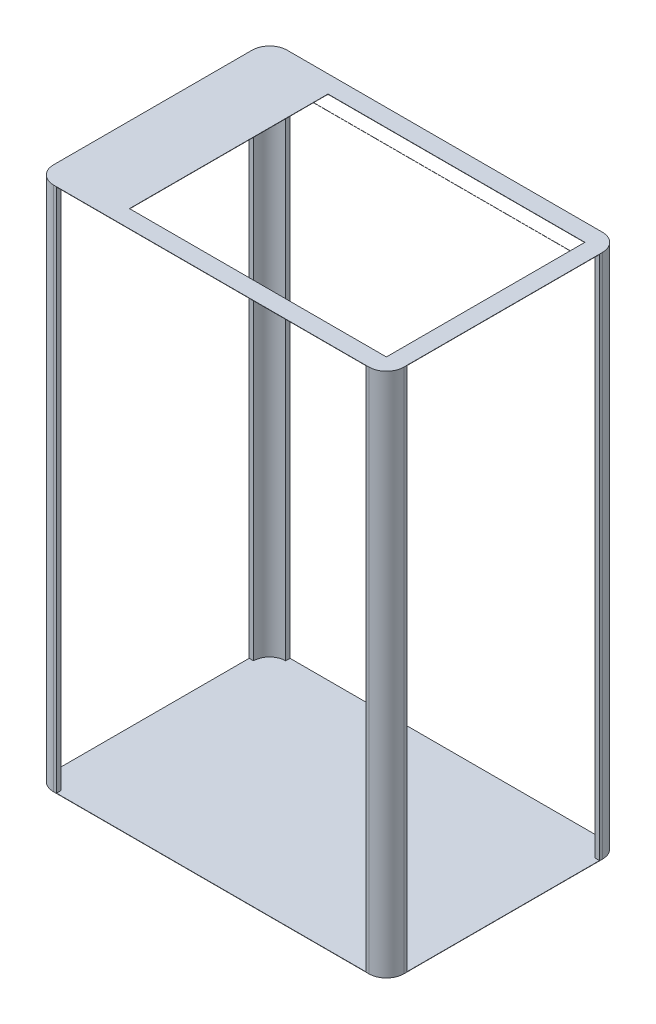
ISO-10303-21;
HEADER;
FILE_DESCRIPTION(('STEP AP214'),'2;1');
FILE_NAME('part.step','',(''),(''),'','','');
FILE_SCHEMA(('AUTOMOTIVE_DESIGN { 1 0 10303 214 1 1 1 1 }'));
ENDSEC;
DATA;
#1=APPLICATION_CONTEXT('core data for automotive mechanical design processes');
#2=APPLICATION_PROTOCOL_DEFINITION('international standard','automotive_design',2000,#1);
#3=PRODUCT_CONTEXT('',#1,'mechanical');
#4=PRODUCT('Part','Part','',(#3));
#5=PRODUCT_RELATED_PRODUCT_CATEGORY('part','',(#4));
#6=PRODUCT_DEFINITION_FORMATION('','',#4);
#7=PRODUCT_DEFINITION_CONTEXT('part definition',#1,'design');
#8=PRODUCT_DEFINITION('design','',#6,#7);
#9=PRODUCT_DEFINITION_SHAPE('','',#8);
#10=(LENGTH_UNIT() NAMED_UNIT(*) SI_UNIT(.MILLI.,.METRE.));
#11=(NAMED_UNIT(*) PLANE_ANGLE_UNIT() SI_UNIT($,.RADIAN.));
#12=(NAMED_UNIT(*) SI_UNIT($,.STERADIAN.) SOLID_ANGLE_UNIT());
#13=UNCERTAINTY_MEASURE_WITH_UNIT(LENGTH_MEASURE(1.E-05),#10,'distance_accuracy_value','');
#14=(GEOMETRIC_REPRESENTATION_CONTEXT(3) GLOBAL_UNCERTAINTY_ASSIGNED_CONTEXT((#13)) GLOBAL_UNIT_ASSIGNED_CONTEXT((#10,
#11,#12)) REPRESENTATION_CONTEXT('',''));
#15=CARTESIAN_POINT('',(0.,0.,0.));
#16=DIRECTION('',(0.,0.,1.));
#17=DIRECTION('',(1.,0.,0.));
#18=AXIS2_PLACEMENT_3D('',#15,#16,#17);
#19=CARTESIAN_POINT('',(300.,450.,170.));
#20=DIRECTION('',(-1.,0.,0.));
#21=DIRECTION('',(0.,0.,1.));
#22=AXIS2_PLACEMENT_3D('',#19,#20,#21);
#23=PLANE('',#22);
#24=DIRECTION('',(0.,0.,-1.));
#25=VECTOR('',#24,1.);
#26=CARTESIAN_POINT('',(300.,-450.,170.));
#27=LINE('',#26,#25);
#28=CARTESIAN_POINT('',(300.,-450.,170.));
#29=VERTEX_POINT('',#28);
#30=CARTESIAN_POINT('',(300.,-450.,-170.));
#31=VERTEX_POINT('',#30);
#32=EDGE_CURVE('E480',#29,#31,#27,.T.);
#33=ORIENTED_EDGE('',*,*,#32,.T.);
#34=DIRECTION('',(0.,-1.,0.));
#35=VECTOR('',#34,1.);
#36=CARTESIAN_POINT('',(300.,450.,-170.));
#37=LINE('',#36,#35);
#38=CARTESIAN_POINT('',(300.,450.,-170.));
#39=VERTEX_POINT('',#38);
#40=EDGE_CURVE('E523',#39,#31,#37,.T.);
#41=ORIENTED_EDGE('',*,*,#40,.F.);
#42=DIRECTION('',(0.,0.,-1.));
#43=VECTOR('',#42,1.);
#44=CARTESIAN_POINT('',(300.,450.,170.));
#45=LINE('',#44,#43);
#46=CARTESIAN_POINT('',(300.,450.,170.));
#47=VERTEX_POINT('',#46);
#48=EDGE_CURVE('E454',#47,#39,#45,.T.);
#49=ORIENTED_EDGE('',*,*,#48,.F.);
#50=DIRECTION('',(0.,-1.,0.));
#51=VECTOR('',#50,1.);
#52=CARTESIAN_POINT('',(300.,450.,170.));
#53=LINE('',#52,#51);
#54=EDGE_CURVE('E527',#47,#29,#53,.T.);
#55=ORIENTED_EDGE('',*,*,#54,.T.);
#56=EDGE_LOOP('',(#33,#41,#49,#55));
#57=FACE_BOUND('',#56,.T.);
#58=DIRECTION('',(0.,0.,-1.));
#59=VECTOR('',#58,1.);
#60=CARTESIAN_POINT('',(300.,-449.5,165.));
#61=LINE('',#60,#59);
#62=CARTESIAN_POINT('',(300.,-449.5,165.));
#63=VERTEX_POINT('',#62);
#64=CARTESIAN_POINT('',(300.,-449.5,-165.));
#65=VERTEX_POINT('',#64);
#66=EDGE_CURVE('E308',#63,#65,#61,.T.);
#67=ORIENTED_EDGE('',*,*,#66,.F.);
#68=DIRECTION('',(0.,1.,0.));
#69=VECTOR('',#68,1.);
#70=CARTESIAN_POINT('',(300.,-449.5,165.));
#71=LINE('',#70,#69);
#72=CARTESIAN_POINT('',(300.,449.5,165.));
#73=VERTEX_POINT('',#72);
#74=EDGE_CURVE('E416',#63,#73,#71,.T.);
#75=ORIENTED_EDGE('',*,*,#74,.T.);
#76=DIRECTION('',(0.,0.,-1.));
#77=VECTOR('',#76,1.);
#78=CARTESIAN_POINT('',(300.,449.5,165.));
#79=LINE('',#78,#77);
#80=CARTESIAN_POINT('',(300.,449.5,-165.));
#81=VERTEX_POINT('',#80);
#82=EDGE_CURVE('E371',#73,#81,#79,.T.);
#83=ORIENTED_EDGE('',*,*,#82,.T.);
#84=DIRECTION('',(0.,1.,0.));
#85=VECTOR('',#84,1.);
#86=CARTESIAN_POINT('',(300.,-449.5,-165.));
#87=LINE('',#86,#85);
#88=EDGE_CURVE('E412',#65,#81,#87,.T.);
#89=ORIENTED_EDGE('',*,*,#88,.F.);
#90=EDGE_LOOP('',(#67,#75,#83,#89));
#91=FACE_BOUND('',#90,.T.);
#92=ADVANCED_FACE('F45',(#57,#91),#23,.F.);
#93=CARTESIAN_POINT('',(-270.,450.,-200.));
#94=DIRECTION('',(0.,0.,1.));
#95=DIRECTION('',(1.,0.,0.));
#96=AXIS2_PLACEMENT_3D('',#93,#94,#95);
#97=PLANE('',#96);
#98=DIRECTION('',(-1.,0.,0.));
#99=VECTOR('',#98,1.);
#100=CARTESIAN_POINT('',(-270.,-450.,-200.));
#101=LINE('',#100,#99);
#102=CARTESIAN_POINT('',(270.,-450.,-200.));
#103=VERTEX_POINT('',#102);
#104=CARTESIAN_POINT('',(-270.,-450.,-200.));
#105=VERTEX_POINT('',#104);
#106=EDGE_CURVE('E486',#103,#105,#101,.T.);
#107=ORIENTED_EDGE('',*,*,#106,.T.);
#108=DIRECTION('',(0.,-1.,0.));
#109=VECTOR('',#108,1.);
#110=CARTESIAN_POINT('',(-270.,450.,-200.));
#111=LINE('',#110,#109);
#112=CARTESIAN_POINT('',(-270.,450.,-200.));
#113=VERTEX_POINT('',#112);
#114=EDGE_CURVE('E515',#113,#105,#111,.T.);
#115=ORIENTED_EDGE('',*,*,#114,.F.);
#116=DIRECTION('',(-1.,0.,0.));
#117=VECTOR('',#116,1.);
#118=CARTESIAN_POINT('',(-270.,450.,-200.));
#119=LINE('',#118,#117);
#120=CARTESIAN_POINT('',(270.,450.,-200.));
#121=VERTEX_POINT('',#120);
#122=EDGE_CURVE('E461',#121,#113,#119,.T.);
#123=ORIENTED_EDGE('',*,*,#122,.F.);
#124=DIRECTION('',(0.,-1.,0.));
#125=VECTOR('',#124,1.);
#126=CARTESIAN_POINT('',(270.,450.,-200.));
#127=LINE('',#126,#125);
#128=EDGE_CURVE('E519',#121,#103,#127,.T.);
#129=ORIENTED_EDGE('',*,*,#128,.T.);
#130=EDGE_LOOP('',(#107,#115,#123,#129));
#131=FACE_BOUND('',#130,.T.);
#132=DIRECTION('',(-1.,0.,0.));
#133=VECTOR('',#132,1.);
#134=CARTESIAN_POINT('',(-265.,-449.5,-200.));
#135=LINE('',#134,#133);
#136=CARTESIAN_POINT('',(265.,-449.5,-200.));
#137=VERTEX_POINT('',#136);
#138=CARTESIAN_POINT('',(-265.,-449.5,-200.));
#139=VERTEX_POINT('',#138);
#140=EDGE_CURVE('E324',#137,#139,#135,.T.);
#141=ORIENTED_EDGE('',*,*,#140,.F.);
#142=DIRECTION('',(0.,1.,0.));
#143=VECTOR('',#142,1.);
#144=CARTESIAN_POINT('',(265.,-449.5,-200.));
#145=LINE('',#144,#143);
#146=CARTESIAN_POINT('',(265.,449.5,-200.));
#147=VERTEX_POINT('',#146);
#148=EDGE_CURVE('E402',#137,#147,#145,.T.);
#149=ORIENTED_EDGE('',*,*,#148,.T.);
#150=DIRECTION('',(-1.,0.,0.));
#151=VECTOR('',#150,1.);
#152=CARTESIAN_POINT('',(-265.,449.5,-200.));
#153=LINE('',#152,#151);
#154=CARTESIAN_POINT('',(-265.,449.5,-200.));
#155=VERTEX_POINT('',#154);
#156=EDGE_CURVE('E387',#147,#155,#153,.T.);
#157=ORIENTED_EDGE('',*,*,#156,.T.);
#158=DIRECTION('',(0.,1.,0.));
#159=VECTOR('',#158,1.);
#160=CARTESIAN_POINT('',(-265.,-449.5,-200.));
#161=LINE('',#160,#159);
#162=EDGE_CURVE('E398',#139,#155,#161,.T.);
#163=ORIENTED_EDGE('',*,*,#162,.F.);
#164=EDGE_LOOP('',(#141,#149,#157,#163));
#165=FACE_BOUND('',#164,.T.);
#166=ADVANCED_FACE('F559',(#131,#165),#97,.F.);
#167=CARTESIAN_POINT('',(-300.,450.,170.));
#168=DIRECTION('',(1.,0.,0.));
#169=DIRECTION('',(0.,0.,-1.));
#170=AXIS2_PLACEMENT_3D('',#167,#168,#169);
#171=PLANE('',#170);
#172=DIRECTION('',(0.,0.,1.));
#173=VECTOR('',#172,1.);
#174=CARTESIAN_POINT('',(-300.,-450.,170.));
#175=LINE('',#174,#173);
#176=CARTESIAN_POINT('',(-300.,-450.,-170.));
#177=VERTEX_POINT('',#176);
#178=CARTESIAN_POINT('',(-300.,-450.,170.));
#179=VERTEX_POINT('',#178);
#180=EDGE_CURVE('E492',#177,#179,#175,.T.);
#181=ORIENTED_EDGE('',*,*,#180,.T.);
#182=DIRECTION('',(0.,-1.,0.));
#183=VECTOR('',#182,1.);
#184=CARTESIAN_POINT('',(-300.,450.,170.));
#185=LINE('',#184,#183);
#186=CARTESIAN_POINT('',(-300.,450.,170.));
#187=VERTEX_POINT('',#186);
#188=EDGE_CURVE('E507',#187,#179,#185,.T.);
#189=ORIENTED_EDGE('',*,*,#188,.F.);
#190=DIRECTION('',(0.,0.,1.));
#191=VECTOR('',#190,1.);
#192=CARTESIAN_POINT('',(-300.,450.,170.));
#193=LINE('',#192,#191);
#194=CARTESIAN_POINT('',(-300.,450.,-170.));
#195=VERTEX_POINT('',#194);
#196=EDGE_CURVE('E467',#195,#187,#193,.T.);
#197=ORIENTED_EDGE('',*,*,#196,.F.);
#198=DIRECTION('',(0.,-1.,0.));
#199=VECTOR('',#198,1.);
#200=CARTESIAN_POINT('',(-300.,450.,-170.));
#201=LINE('',#200,#199);
#202=EDGE_CURVE('E511',#195,#177,#201,.T.);
#203=ORIENTED_EDGE('',*,*,#202,.T.);
#204=EDGE_LOOP('',(#181,#189,#197,#203));
#205=FACE_BOUND('',#204,.T.);
#206=DIRECTION('',(0.,0.,1.));
#207=VECTOR('',#206,1.);
#208=CARTESIAN_POINT('',(-300.,-449.5,165.));
#209=LINE('',#208,#207);
#210=CARTESIAN_POINT('',(-300.,-449.5,-165.));
#211=VERTEX_POINT('',#210);
#212=CARTESIAN_POINT('',(-300.,-449.5,165.));
#213=VERTEX_POINT('',#212);
#214=EDGE_CURVE('E276',#211,#213,#209,.T.);
#215=ORIENTED_EDGE('',*,*,#214,.F.);
#216=DIRECTION('',(0.,1.,0.));
#217=VECTOR('',#216,1.);
#218=CARTESIAN_POINT('',(-300.,-449.5,-165.));
#219=LINE('',#218,#217);
#220=CARTESIAN_POINT('',(-300.,449.5,-165.));
#221=VERTEX_POINT('',#220);
#222=EDGE_CURVE('E444',#211,#221,#219,.T.);
#223=ORIENTED_EDGE('',*,*,#222,.T.);
#224=DIRECTION('',(0.,0.,1.));
#225=VECTOR('',#224,1.);
#226=CARTESIAN_POINT('',(-300.,449.5,165.));
#227=LINE('',#226,#225);
#228=CARTESIAN_POINT('',(-300.,449.5,165.));
#229=VERTEX_POINT('',#228);
#230=EDGE_CURVE('E339',#221,#229,#227,.T.);
#231=ORIENTED_EDGE('',*,*,#230,.T.);
#232=DIRECTION('',(0.,1.,0.));
#233=VECTOR('',#232,1.);
#234=CARTESIAN_POINT('',(-300.,-449.5,165.));
#235=LINE('',#234,#233);
#236=EDGE_CURVE('E440',#213,#229,#235,.T.);
#237=ORIENTED_EDGE('',*,*,#236,.F.);
#238=EDGE_LOOP('',(#215,#223,#231,#237));
#239=FACE_BOUND('',#238,.T.);
#240=ADVANCED_FACE('F565',(#205,#239),#171,.F.);
#241=CARTESIAN_POINT('',(-270.,450.,200.));
#242=DIRECTION('',(0.,0.,-1.));
#243=DIRECTION('',(-1.,0.,0.));
#244=AXIS2_PLACEMENT_3D('',#241,#242,#243);
#245=PLANE('',#244);
#246=DIRECTION('',(1.,0.,0.));
#247=VECTOR('',#246,1.);
#248=CARTESIAN_POINT('',(-270.,-450.,200.));
#249=LINE('',#248,#247);
#250=CARTESIAN_POINT('',(-270.,-450.,200.));
#251=VERTEX_POINT('',#250);
#252=CARTESIAN_POINT('',(270.,-450.,200.));
#253=VERTEX_POINT('',#252);
#254=EDGE_CURVE('E455',#251,#253,#249,.T.);
#255=ORIENTED_EDGE('',*,*,#254,.T.);
#256=DIRECTION('',(0.,-1.,0.));
#257=VECTOR('',#256,1.);
#258=CARTESIAN_POINT('',(270.,450.,200.));
#259=LINE('',#258,#257);
#260=CARTESIAN_POINT('',(270.,450.,200.));
#261=VERTEX_POINT('',#260);
#262=EDGE_CURVE('E476',#261,#253,#259,.T.);
#263=ORIENTED_EDGE('',*,*,#262,.F.);
#264=DIRECTION('',(1.,0.,0.));
#265=VECTOR('',#264,1.);
#266=CARTESIAN_POINT('',(-270.,450.,200.));
#267=LINE('',#266,#265);
#268=CARTESIAN_POINT('',(-270.,450.,200.));
#269=VERTEX_POINT('',#268);
#270=EDGE_CURVE('E473',#269,#261,#267,.T.);
#271=ORIENTED_EDGE('',*,*,#270,.F.);
#272=DIRECTION('',(0.,-1.,0.));
#273=VECTOR('',#272,1.);
#274=CARTESIAN_POINT('',(-270.,450.,200.));
#275=LINE('',#274,#273);
#276=EDGE_CURVE('E503',#269,#251,#275,.T.);
#277=ORIENTED_EDGE('',*,*,#276,.T.);
#278=EDGE_LOOP('',(#255,#263,#271,#277));
#279=FACE_BOUND('',#278,.T.);
#280=DIRECTION('',(1.,0.,0.));
#281=VECTOR('',#280,1.);
#282=CARTESIAN_POINT('',(-265.,-449.5,200.));
#283=LINE('',#282,#281);
#284=CARTESIAN_POINT('',(-265.,-449.5,200.));
#285=VERTEX_POINT('',#284);
#286=CARTESIAN_POINT('',(265.,-449.5,200.));
#287=VERTEX_POINT('',#286);
#288=EDGE_CURVE('E292',#285,#287,#283,.T.);
#289=ORIENTED_EDGE('',*,*,#288,.F.);
#290=DIRECTION('',(0.,1.,0.));
#291=VECTOR('',#290,1.);
#292=CARTESIAN_POINT('',(-265.,-449.5,200.));
#293=LINE('',#292,#291);
#294=CARTESIAN_POINT('',(-265.,449.5,200.));
#295=VERTEX_POINT('',#294);
#296=EDGE_CURVE('E430',#285,#295,#293,.T.);
#297=ORIENTED_EDGE('',*,*,#296,.T.);
#298=DIRECTION('',(1.,0.,0.));
#299=VECTOR('',#298,1.);
#300=CARTESIAN_POINT('',(-265.,449.5,200.));
#301=LINE('',#300,#299);
#302=CARTESIAN_POINT('',(265.,449.5,200.));
#303=VERTEX_POINT('',#302);
#304=EDGE_CURVE('E355',#295,#303,#301,.T.);
#305=ORIENTED_EDGE('',*,*,#304,.T.);
#306=DIRECTION('',(0.,1.,0.));
#307=VECTOR('',#306,1.);
#308=CARTESIAN_POINT('',(265.,-449.5,200.));
#309=LINE('',#308,#307);
#310=EDGE_CURVE('E426',#287,#303,#309,.T.);
#311=ORIENTED_EDGE('',*,*,#310,.F.);
#312=EDGE_LOOP('',(#289,#297,#305,#311));
#313=FACE_BOUND('',#312,.T.);
#314=ADVANCED_FACE('F581',(#279,#313),#245,.F.);
#315=CARTESIAN_POINT('',(270.,450.,170.));
#316=DIRECTION('',(0.,-1.,0.));
#317=DIRECTION('',(0.,0.,-1.));
#318=AXIS2_PLACEMENT_3D('',#315,#316,#317);
#319=CYLINDRICAL_SURFACE('',#318,30.);
#320=CARTESIAN_POINT('',(270.,-450.,170.));
#321=DIRECTION('',(0.,1.,0.));
#322=DIRECTION('',(0.,0.,1.));
#323=AXIS2_PLACEMENT_3D('',#320,#321,#322);
#324=CIRCLE('',#323,30.);
#325=EDGE_CURVE('E397',#253,#29,#324,.T.);
#326=ORIENTED_EDGE('',*,*,#325,.T.);
#327=ORIENTED_EDGE('',*,*,#54,.F.);
#328=CARTESIAN_POINT('',(270.,450.,170.));
#329=DIRECTION('',(0.,1.,0.));
#330=DIRECTION('',(0.,0.,1.));
#331=AXIS2_PLACEMENT_3D('',#328,#329,#330);
#332=CIRCLE('',#331,30.);
#333=EDGE_CURVE('E450',#261,#47,#332,.T.);
#334=ORIENTED_EDGE('',*,*,#333,.F.);
#335=ORIENTED_EDGE('',*,*,#262,.T.);
#336=EDGE_LOOP('',(#326,#327,#334,#335));
#337=FACE_BOUND('',#336,.T.);
#338=ADVANCED_FACE('F47',(#337),#319,.T.);
#339=CARTESIAN_POINT('',(270.,450.,-170.));
#340=DIRECTION('',(0.,-1.,0.));
#341=DIRECTION('',(0.,0.,-1.));
#342=AXIS2_PLACEMENT_3D('',#339,#340,#341);
#343=CYLINDRICAL_SURFACE('',#342,29.9999999999999);
#344=CARTESIAN_POINT('',(270.,-450.,-170.));
#345=DIRECTION('',(0.,1.,0.));
#346=DIRECTION('',(0.,0.,1.));
#347=AXIS2_PLACEMENT_3D('',#344,#345,#346);
#348=CIRCLE('',#347,29.9999999999999);
#349=EDGE_CURVE('E483',#31,#103,#348,.T.);
#350=ORIENTED_EDGE('',*,*,#349,.T.);
#351=ORIENTED_EDGE('',*,*,#128,.F.);
#352=CARTESIAN_POINT('',(270.,450.,-170.));
#353=DIRECTION('',(0.,1.,0.));
#354=DIRECTION('',(0.,0.,1.));
#355=AXIS2_PLACEMENT_3D('',#352,#353,#354);
#356=CIRCLE('',#355,29.9999999999999);
#357=EDGE_CURVE('E458',#39,#121,#356,.T.);
#358=ORIENTED_EDGE('',*,*,#357,.F.);
#359=ORIENTED_EDGE('',*,*,#40,.T.);
#360=EDGE_LOOP('',(#350,#351,#358,#359));
#361=FACE_BOUND('',#360,.T.);
#362=ADVANCED_FACE('F570',(#361),#343,.T.);
#363=CARTESIAN_POINT('',(-270.,450.,-170.));
#364=DIRECTION('',(0.,-1.,0.));
#365=DIRECTION('',(0.,0.,-1.));
#366=AXIS2_PLACEMENT_3D('',#363,#364,#365);
#367=CYLINDRICAL_SURFACE('',#366,30.);
#368=CARTESIAN_POINT('',(-270.,-450.,-170.));
#369=DIRECTION('',(0.,1.,0.));
#370=DIRECTION('',(0.,0.,1.));
#371=AXIS2_PLACEMENT_3D('',#368,#369,#370);
#372=CIRCLE('',#371,30.);
#373=EDGE_CURVE('E489',#105,#177,#372,.T.);
#374=ORIENTED_EDGE('',*,*,#373,.T.);
#375=ORIENTED_EDGE('',*,*,#202,.F.);
#376=CARTESIAN_POINT('',(-270.,450.,-170.));
#377=DIRECTION('',(0.,1.,0.));
#378=DIRECTION('',(0.,0.,1.));
#379=AXIS2_PLACEMENT_3D('',#376,#377,#378);
#380=CIRCLE('',#379,30.);
#381=EDGE_CURVE('E464',#113,#195,#380,.T.);
#382=ORIENTED_EDGE('',*,*,#381,.F.);
#383=ORIENTED_EDGE('',*,*,#114,.T.);
#384=EDGE_LOOP('',(#374,#375,#382,#383));
#385=FACE_BOUND('',#384,.T.);
#386=ADVANCED_FACE('F572',(#385),#367,.T.);
#387=CARTESIAN_POINT('',(-270.,450.,170.));
#388=DIRECTION('',(0.,-1.,0.));
#389=DIRECTION('',(0.,0.,-1.));
#390=AXIS2_PLACEMENT_3D('',#387,#388,#389);
#391=CYLINDRICAL_SURFACE('',#390,30.);
#392=CARTESIAN_POINT('',(-270.,-450.,170.));
#393=DIRECTION('',(0.,1.,0.));
#394=DIRECTION('',(0.,0.,1.));
#395=AXIS2_PLACEMENT_3D('',#392,#393,#394);
#396=CIRCLE('',#395,30.);
#397=EDGE_CURVE('E495',#179,#251,#396,.T.);
#398=ORIENTED_EDGE('',*,*,#397,.T.);
#399=ORIENTED_EDGE('',*,*,#276,.F.);
#400=CARTESIAN_POINT('',(-270.,450.,170.));
#401=DIRECTION('',(0.,1.,0.));
#402=DIRECTION('',(0.,0.,1.));
#403=AXIS2_PLACEMENT_3D('',#400,#401,#402);
#404=CIRCLE('',#403,30.);
#405=EDGE_CURVE('E470',#187,#269,#404,.T.);
#406=ORIENTED_EDGE('',*,*,#405,.F.);
#407=ORIENTED_EDGE('',*,*,#188,.T.);
#408=EDGE_LOOP('',(#398,#399,#406,#407));
#409=FACE_BOUND('',#408,.T.);
#410=ADVANCED_FACE('F577',(#409),#391,.T.);
#411=CARTESIAN_POINT('',(270.,450.,170.));
#412=DIRECTION('',(0.,1.,0.));
#413=DIRECTION('',(0.,0.,1.));
#414=AXIS2_PLACEMENT_3D('',#411,#412,#413);
#415=PLANE('',#414);
#416=DIRECTION('',(0.,0.,-1.));
#417=VECTOR('',#416,1.);
#418=CARTESIAN_POINT('',(270.,450.,170.));
#419=LINE('',#418,#417);
#420=CARTESIAN_POINT('',(270.,450.,170.));
#421=VERTEX_POINT('',#420);
#422=CARTESIAN_POINT('',(270.,450.,-170.));
#423=VERTEX_POINT('',#422);
#424=EDGE_CURVE('E61',#421,#423,#419,.T.);
#425=ORIENTED_EDGE('',*,*,#424,.F.);
#426=DIRECTION('',(1.,0.,0.));
#427=VECTOR('',#426,1.);
#428=CARTESIAN_POINT('',(-170.,450.,170.));
#429=LINE('',#428,#427);
#430=CARTESIAN_POINT('',(-170.,450.,170.));
#431=VERTEX_POINT('',#430);
#432=EDGE_CURVE('E252',#431,#421,#429,.T.);
#433=ORIENTED_EDGE('',*,*,#432,.F.);
#434=DIRECTION('',(0.,0.,1.));
#435=VECTOR('',#434,1.);
#436=CARTESIAN_POINT('',(-170.,450.,170.));
#437=LINE('',#436,#435);
#438=CARTESIAN_POINT('',(-170.,450.,-170.));
#439=VERTEX_POINT('',#438);
#440=EDGE_CURVE('E234',#439,#431,#437,.T.);
#441=ORIENTED_EDGE('',*,*,#440,.F.);
#442=DIRECTION('',(-1.,0.,0.));
#443=VECTOR('',#442,1.);
#444=CARTESIAN_POINT('',(-170.,450.,-170.));
#445=LINE('',#444,#443);
#446=EDGE_CURVE('E244',#423,#439,#445,.T.);
#447=ORIENTED_EDGE('',*,*,#446,.F.);
#448=EDGE_LOOP('',(#425,#433,#441,#447));
#449=FACE_BOUND('',#448,.T.);
#450=ORIENTED_EDGE('',*,*,#333,.T.);
#451=ORIENTED_EDGE('',*,*,#48,.T.);
#452=ORIENTED_EDGE('',*,*,#357,.T.);
#453=ORIENTED_EDGE('',*,*,#122,.T.);
#454=ORIENTED_EDGE('',*,*,#381,.T.);
#455=ORIENTED_EDGE('',*,*,#196,.T.);
#456=ORIENTED_EDGE('',*,*,#405,.T.);
#457=ORIENTED_EDGE('',*,*,#270,.T.);
#458=EDGE_LOOP('',(#450,#451,#452,#453,#454,#455,#456,#457));
#459=FACE_BOUND('',#458,.T.);
#460=ADVANCED_FACE('F249',(#449,#459),#415,.T.);
#461=CARTESIAN_POINT('',(270.,-450.,170.));
#462=DIRECTION('',(0.,1.,0.));
#463=DIRECTION('',(0.,0.,1.));
#464=AXIS2_PLACEMENT_3D('',#461,#462,#463);
#465=PLANE('',#464);
#466=ORIENTED_EDGE('',*,*,#325,.F.);
#467=ORIENTED_EDGE('',*,*,#254,.F.);
#468=ORIENTED_EDGE('',*,*,#397,.F.);
#469=ORIENTED_EDGE('',*,*,#180,.F.);
#470=ORIENTED_EDGE('',*,*,#373,.F.);
#471=ORIENTED_EDGE('',*,*,#106,.F.);
#472=ORIENTED_EDGE('',*,*,#349,.F.);
#473=ORIENTED_EDGE('',*,*,#32,.F.);
#474=EDGE_LOOP('',(#466,#467,#468,#469,#470,#471,#472,#473));
#475=FACE_BOUND('',#474,.T.);
#476=ADVANCED_FACE('F589',(#475),#465,.F.);
#477=CARTESIAN_POINT('',(-265.,-449.5,-165.));
#478=DIRECTION('',(0.,1.,0.));
#479=DIRECTION('',(0.,0.,1.));
#480=AXIS2_PLACEMENT_3D('',#477,#478,#479);
#481=CYLINDRICAL_SURFACE('',#480,27.5);
#482=CARTESIAN_POINT('',(-265.,449.5,-165.));
#483=DIRECTION('',(0.,1.,0.));
#484=DIRECTION('',(0.,0.,1.));
#485=AXIS2_PLACEMENT_3D('',#482,#483,#484);
#486=CIRCLE('',#485,27.5);
#487=CARTESIAN_POINT('',(-265.,449.5,-192.5));
#488=VERTEX_POINT('',#487);
#489=CARTESIAN_POINT('',(-292.5,449.5,-165.));
#490=VERTEX_POINT('',#489);
#491=EDGE_CURVE('E262',#488,#490,#486,.T.);
#492=ORIENTED_EDGE('',*,*,#491,.T.);
#493=DIRECTION('',(0.,1.,0.));
#494=VECTOR('',#493,1.);
#495=CARTESIAN_POINT('',(-292.5,-449.5,-165.));
#496=LINE('',#495,#494);
#497=CARTESIAN_POINT('',(-292.5,-449.5,-165.));
#498=VERTEX_POINT('',#497);
#499=EDGE_CURVE('E331',#498,#490,#496,.T.);
#500=ORIENTED_EDGE('',*,*,#499,.F.);
#501=CARTESIAN_POINT('',(-265.,-449.5,-165.));
#502=DIRECTION('',(0.,1.,0.));
#503=DIRECTION('',(0.,0.,1.));
#504=AXIS2_PLACEMENT_3D('',#501,#502,#503);
#505=CIRCLE('',#504,27.5);
#506=CARTESIAN_POINT('',(-265.,-449.5,-192.5));
#507=VERTEX_POINT('',#506);
#508=EDGE_CURVE('E267',#507,#498,#505,.T.);
#509=ORIENTED_EDGE('',*,*,#508,.F.);
#510=DIRECTION('',(0.,1.,0.));
#511=VECTOR('',#510,1.);
#512=CARTESIAN_POINT('',(-265.,-449.5,-192.5));
#513=LINE('',#512,#511);
#514=EDGE_CURVE('E394',#507,#488,#513,.T.);
#515=ORIENTED_EDGE('',*,*,#514,.T.);
#516=EDGE_LOOP('',(#492,#500,#509,#515));
#517=FACE_BOUND('',#516,.T.);
#518=ADVANCED_FACE('F592',(#517),#481,.F.);
#519=CARTESIAN_POINT('',(-265.,-449.5,-192.5));
#520=DIRECTION('',(-1.,0.,0.));
#521=DIRECTION('',(0.,0.,1.));
#522=AXIS2_PLACEMENT_3D('',#519,#520,#521);
#523=PLANE('',#522);
#524=DIRECTION('',(0.,0.,1.));
#525=VECTOR('',#524,1.);
#526=CARTESIAN_POINT('',(-265.,449.5,-192.5));
#527=LINE('',#526,#525);
#528=EDGE_CURVE('E272',#155,#488,#527,.T.);
#529=ORIENTED_EDGE('',*,*,#528,.T.);
#530=ORIENTED_EDGE('',*,*,#514,.F.);
#531=DIRECTION('',(0.,0.,1.));
#532=VECTOR('',#531,1.);
#533=CARTESIAN_POINT('',(-265.,-449.5,-192.5));
#534=LINE('',#533,#532);
#535=EDGE_CURVE('E327',#139,#507,#534,.T.);
#536=ORIENTED_EDGE('',*,*,#535,.F.);
#537=ORIENTED_EDGE('',*,*,#162,.T.);
#538=EDGE_LOOP('',(#529,#530,#536,#537));
#539=FACE_BOUND('',#538,.T.);
#540=ADVANCED_FACE('F598',(#539),#523,.F.);
#541=CARTESIAN_POINT('',(265.,-449.5,-192.5));
#542=DIRECTION('',(1.,0.,0.));
#543=DIRECTION('',(0.,0.,-1.));
#544=AXIS2_PLACEMENT_3D('',#541,#542,#543);
#545=PLANE('',#544);
#546=DIRECTION('',(0.,0.,-1.));
#547=VECTOR('',#546,1.);
#548=CARTESIAN_POINT('',(265.,449.5,-192.5));
#549=LINE('',#548,#547);
#550=CARTESIAN_POINT('',(265.,449.5,-192.5));
#551=VERTEX_POINT('',#550);
#552=EDGE_CURVE('E383',#551,#147,#549,.T.);
#553=ORIENTED_EDGE('',*,*,#552,.T.);
#554=ORIENTED_EDGE('',*,*,#148,.F.);
#555=DIRECTION('',(0.,0.,-1.));
#556=VECTOR('',#555,1.);
#557=CARTESIAN_POINT('',(265.,-449.5,-192.5));
#558=LINE('',#557,#556);
#559=CARTESIAN_POINT('',(265.,-449.5,-192.5));
#560=VERTEX_POINT('',#559);
#561=EDGE_CURVE('E320',#560,#137,#558,.T.);
#562=ORIENTED_EDGE('',*,*,#561,.F.);
#563=DIRECTION('',(0.,1.,0.));
#564=VECTOR('',#563,1.);
#565=CARTESIAN_POINT('',(265.,-449.5,-192.5));
#566=LINE('',#565,#564);
#567=EDGE_CURVE('E406',#560,#551,#566,.T.);
#568=ORIENTED_EDGE('',*,*,#567,.T.);
#569=EDGE_LOOP('',(#553,#554,#562,#568));
#570=FACE_BOUND('',#569,.T.);
#571=ADVANCED_FACE('F635',(#570),#545,.F.);
#572=CARTESIAN_POINT('',(265.,-449.5,-165.));
#573=DIRECTION('',(0.,1.,0.));
#574=DIRECTION('',(0.,0.,1.));
#575=AXIS2_PLACEMENT_3D('',#572,#573,#574);
#576=CYLINDRICAL_SURFACE('',#575,27.5);
#577=CARTESIAN_POINT('',(265.,449.5,-165.));
#578=DIRECTION('',(0.,1.,0.));
#579=DIRECTION('',(0.,0.,1.));
#580=AXIS2_PLACEMENT_3D('',#577,#578,#579);
#581=CIRCLE('',#580,27.5);
#582=CARTESIAN_POINT('',(292.5,449.5,-165.));
#583=VERTEX_POINT('',#582);
#584=EDGE_CURVE('E379',#583,#551,#581,.T.);
#585=ORIENTED_EDGE('',*,*,#584,.T.);
#586=ORIENTED_EDGE('',*,*,#567,.F.);
#587=CARTESIAN_POINT('',(265.,-449.5,-165.));
#588=DIRECTION('',(0.,1.,0.));
#589=DIRECTION('',(0.,0.,1.));
#590=AXIS2_PLACEMENT_3D('',#587,#588,#589);
#591=CIRCLE('',#590,27.5);
#592=CARTESIAN_POINT('',(292.5,-449.5,-165.));
#593=VERTEX_POINT('',#592);
#594=EDGE_CURVE('E316',#593,#560,#591,.T.);
#595=ORIENTED_EDGE('',*,*,#594,.F.);
#596=DIRECTION('',(0.,1.,0.));
#597=VECTOR('',#596,1.);
#598=CARTESIAN_POINT('',(292.5,-449.5,-165.));
#599=LINE('',#598,#597);
#600=EDGE_CURVE('E409',#593,#583,#599,.T.);
#601=ORIENTED_EDGE('',*,*,#600,.T.);
#602=EDGE_LOOP('',(#585,#586,#595,#601));
#603=FACE_BOUND('',#602,.T.);
#604=ADVANCED_FACE('F631',(#603),#576,.F.);
#605=CARTESIAN_POINT('',(292.5,-449.5,-165.));
#606=DIRECTION('',(0.,0.,-1.));
#607=DIRECTION('',(-1.,0.,0.));
#608=AXIS2_PLACEMENT_3D('',#605,#606,#607);
#609=PLANE('',#608);
#610=DIRECTION('',(-1.,0.,0.));
#611=VECTOR('',#610,1.);
#612=CARTESIAN_POINT('',(292.5,449.5,-165.));
#613=LINE('',#612,#611);
#614=EDGE_CURVE('E375',#81,#583,#613,.T.);
#615=ORIENTED_EDGE('',*,*,#614,.T.);
#616=ORIENTED_EDGE('',*,*,#600,.F.);
#617=DIRECTION('',(-1.,0.,0.));
#618=VECTOR('',#617,1.);
#619=CARTESIAN_POINT('',(292.5,-449.5,-165.));
#620=LINE('',#619,#618);
#621=EDGE_CURVE('E312',#65,#593,#620,.T.);
#622=ORIENTED_EDGE('',*,*,#621,.F.);
#623=ORIENTED_EDGE('',*,*,#88,.T.);
#624=EDGE_LOOP('',(#615,#616,#622,#623));
#625=FACE_BOUND('',#624,.T.);
#626=ADVANCED_FACE('F627',(#625),#609,.F.);
#627=CARTESIAN_POINT('',(292.5,-449.5,165.));
#628=DIRECTION('',(0.,0.,1.));
#629=DIRECTION('',(1.,0.,0.));
#630=AXIS2_PLACEMENT_3D('',#627,#628,#629);
#631=PLANE('',#630);
#632=DIRECTION('',(1.,0.,0.));
#633=VECTOR('',#632,1.);
#634=CARTESIAN_POINT('',(292.5,449.5,165.));
#635=LINE('',#634,#633);
#636=CARTESIAN_POINT('',(292.5,449.5,165.));
#637=VERTEX_POINT('',#636);
#638=EDGE_CURVE('E367',#637,#73,#635,.T.);
#639=ORIENTED_EDGE('',*,*,#638,.T.);
#640=ORIENTED_EDGE('',*,*,#74,.F.);
#641=DIRECTION('',(1.,0.,0.));
#642=VECTOR('',#641,1.);
#643=CARTESIAN_POINT('',(292.5,-449.5,165.));
#644=LINE('',#643,#642);
#645=CARTESIAN_POINT('',(292.5,-449.5,165.));
#646=VERTEX_POINT('',#645);
#647=EDGE_CURVE('E304',#646,#63,#644,.T.);
#648=ORIENTED_EDGE('',*,*,#647,.F.);
#649=DIRECTION('',(0.,1.,0.));
#650=VECTOR('',#649,1.);
#651=CARTESIAN_POINT('',(292.5,-449.5,165.));
#652=LINE('',#651,#650);
#653=EDGE_CURVE('E420',#646,#637,#652,.T.);
#654=ORIENTED_EDGE('',*,*,#653,.T.);
#655=EDGE_LOOP('',(#639,#640,#648,#654));
#656=FACE_BOUND('',#655,.T.);
#657=ADVANCED_FACE('F623',(#656),#631,.F.);
#658=CARTESIAN_POINT('',(265.,-449.5,165.));
#659=DIRECTION('',(0.,1.,0.));
#660=DIRECTION('',(0.,0.,1.));
#661=AXIS2_PLACEMENT_3D('',#658,#659,#660);
#662=CYLINDRICAL_SURFACE('',#661,27.5);
#663=CARTESIAN_POINT('',(265.,449.5,165.));
#664=DIRECTION('',(0.,1.,0.));
#665=DIRECTION('',(0.,0.,1.));
#666=AXIS2_PLACEMENT_3D('',#663,#664,#665);
#667=CIRCLE('',#666,27.5);
#668=CARTESIAN_POINT('',(265.,449.5,192.5));
#669=VERTEX_POINT('',#668);
#670=EDGE_CURVE('E363',#669,#637,#667,.T.);
#671=ORIENTED_EDGE('',*,*,#670,.T.);
#672=ORIENTED_EDGE('',*,*,#653,.F.);
#673=CARTESIAN_POINT('',(265.,-449.5,165.));
#674=DIRECTION('',(0.,1.,0.));
#675=DIRECTION('',(0.,0.,1.));
#676=AXIS2_PLACEMENT_3D('',#673,#674,#675);
#677=CIRCLE('',#676,27.5);
#678=CARTESIAN_POINT('',(265.,-449.5,192.5));
#679=VERTEX_POINT('',#678);
#680=EDGE_CURVE('E300',#679,#646,#677,.T.);
#681=ORIENTED_EDGE('',*,*,#680,.F.);
#682=DIRECTION('',(0.,1.,0.));
#683=VECTOR('',#682,1.);
#684=CARTESIAN_POINT('',(265.,-449.5,192.5));
#685=LINE('',#684,#683);
#686=EDGE_CURVE('E423',#679,#669,#685,.T.);
#687=ORIENTED_EDGE('',*,*,#686,.T.);
#688=EDGE_LOOP('',(#671,#672,#681,#687));
#689=FACE_BOUND('',#688,.T.);
#690=ADVANCED_FACE('F619',(#689),#662,.F.);
#691=CARTESIAN_POINT('',(265.,-449.5,192.5));
#692=DIRECTION('',(1.,0.,0.));
#693=DIRECTION('',(0.,0.,-1.));
#694=AXIS2_PLACEMENT_3D('',#691,#692,#693);
#695=PLANE('',#694);
#696=DIRECTION('',(0.,0.,-1.));
#697=VECTOR('',#696,1.);
#698=CARTESIAN_POINT('',(265.,449.5,192.5));
#699=LINE('',#698,#697);
#700=EDGE_CURVE('E359',#303,#669,#699,.T.);
#701=ORIENTED_EDGE('',*,*,#700,.T.);
#702=ORIENTED_EDGE('',*,*,#686,.F.);
#703=DIRECTION('',(0.,0.,-1.));
#704=VECTOR('',#703,1.);
#705=CARTESIAN_POINT('',(265.,-449.5,192.5));
#706=LINE('',#705,#704);
#707=EDGE_CURVE('E296',#287,#679,#706,.T.);
#708=ORIENTED_EDGE('',*,*,#707,.F.);
#709=ORIENTED_EDGE('',*,*,#310,.T.);
#710=EDGE_LOOP('',(#701,#702,#708,#709));
#711=FACE_BOUND('',#710,.T.);
#712=ADVANCED_FACE('F615',(#711),#695,.F.);
#713=CARTESIAN_POINT('',(-265.,-449.5,192.5));
#714=DIRECTION('',(-1.,0.,0.));
#715=DIRECTION('',(0.,0.,1.));
#716=AXIS2_PLACEMENT_3D('',#713,#714,#715);
#717=PLANE('',#716);
#718=DIRECTION('',(0.,0.,1.));
#719=VECTOR('',#718,1.);
#720=CARTESIAN_POINT('',(-265.,449.5,192.5));
#721=LINE('',#720,#719);
#722=CARTESIAN_POINT('',(-265.,449.5,192.5));
#723=VERTEX_POINT('',#722);
#724=EDGE_CURVE('E351',#723,#295,#721,.T.);
#725=ORIENTED_EDGE('',*,*,#724,.T.);
#726=ORIENTED_EDGE('',*,*,#296,.F.);
#727=DIRECTION('',(0.,0.,1.));
#728=VECTOR('',#727,1.);
#729=CARTESIAN_POINT('',(-265.,-449.5,192.5));
#730=LINE('',#729,#728);
#731=CARTESIAN_POINT('',(-265.,-449.5,192.5));
#732=VERTEX_POINT('',#731);
#733=EDGE_CURVE('E288',#732,#285,#730,.T.);
#734=ORIENTED_EDGE('',*,*,#733,.F.);
#735=DIRECTION('',(0.,1.,0.));
#736=VECTOR('',#735,1.);
#737=CARTESIAN_POINT('',(-265.,-449.5,192.5));
#738=LINE('',#737,#736);
#739=EDGE_CURVE('E434',#732,#723,#738,.T.);
#740=ORIENTED_EDGE('',*,*,#739,.T.);
#741=EDGE_LOOP('',(#725,#726,#734,#740));
#742=FACE_BOUND('',#741,.T.);
#743=ADVANCED_FACE('F611',(#742),#717,.F.);
#744=CARTESIAN_POINT('',(-265.,-449.5,165.));
#745=DIRECTION('',(0.,1.,0.));
#746=DIRECTION('',(0.,0.,1.));
#747=AXIS2_PLACEMENT_3D('',#744,#745,#746);
#748=CYLINDRICAL_SURFACE('',#747,27.5);
#749=CARTESIAN_POINT('',(-265.,449.5,165.));
#750=DIRECTION('',(0.,1.,0.));
#751=DIRECTION('',(0.,0.,1.));
#752=AXIS2_PLACEMENT_3D('',#749,#750,#751);
#753=CIRCLE('',#752,27.5);
#754=CARTESIAN_POINT('',(-292.5,449.5,165.));
#755=VERTEX_POINT('',#754);
#756=EDGE_CURVE('E347',#755,#723,#753,.T.);
#757=ORIENTED_EDGE('',*,*,#756,.T.);
#758=ORIENTED_EDGE('',*,*,#739,.F.);
#759=CARTESIAN_POINT('',(-265.,-449.5,165.));
#760=DIRECTION('',(0.,1.,0.));
#761=DIRECTION('',(0.,0.,1.));
#762=AXIS2_PLACEMENT_3D('',#759,#760,#761);
#763=CIRCLE('',#762,27.5);
#764=CARTESIAN_POINT('',(-292.5,-449.5,165.));
#765=VERTEX_POINT('',#764);
#766=EDGE_CURVE('E284',#765,#732,#763,.T.);
#767=ORIENTED_EDGE('',*,*,#766,.F.);
#768=DIRECTION('',(0.,1.,0.));
#769=VECTOR('',#768,1.);
#770=CARTESIAN_POINT('',(-292.5,-449.5,165.));
#771=LINE('',#770,#769);
#772=EDGE_CURVE('E437',#765,#755,#771,.T.);
#773=ORIENTED_EDGE('',*,*,#772,.T.);
#774=EDGE_LOOP('',(#757,#758,#767,#773));
#775=FACE_BOUND('',#774,.T.);
#776=ADVANCED_FACE('F607',(#775),#748,.F.);
#777=CARTESIAN_POINT('',(-292.5,-449.5,165.));
#778=DIRECTION('',(0.,0.,1.));
#779=DIRECTION('',(1.,0.,0.));
#780=AXIS2_PLACEMENT_3D('',#777,#778,#779);
#781=PLANE('',#780);
#782=DIRECTION('',(1.,0.,0.));
#783=VECTOR('',#782,1.);
#784=CARTESIAN_POINT('',(-292.5,449.5,165.));
#785=LINE('',#784,#783);
#786=EDGE_CURVE('E343',#229,#755,#785,.T.);
#787=ORIENTED_EDGE('',*,*,#786,.T.);
#788=ORIENTED_EDGE('',*,*,#772,.F.);
#789=DIRECTION('',(1.,0.,0.));
#790=VECTOR('',#789,1.);
#791=CARTESIAN_POINT('',(-292.5,-449.5,165.));
#792=LINE('',#791,#790);
#793=EDGE_CURVE('E280',#213,#765,#792,.T.);
#794=ORIENTED_EDGE('',*,*,#793,.F.);
#795=ORIENTED_EDGE('',*,*,#236,.T.);
#796=EDGE_LOOP('',(#787,#788,#794,#795));
#797=FACE_BOUND('',#796,.T.);
#798=ADVANCED_FACE('F603',(#797),#781,.F.);
#799=CARTESIAN_POINT('',(-292.5,-449.5,-165.));
#800=DIRECTION('',(0.,0.,-1.));
#801=DIRECTION('',(-1.,0.,0.));
#802=AXIS2_PLACEMENT_3D('',#799,#800,#801);
#803=PLANE('',#802);
#804=DIRECTION('',(-1.,0.,0.));
#805=VECTOR('',#804,1.);
#806=CARTESIAN_POINT('',(-292.5,449.5,-165.));
#807=LINE('',#806,#805);
#808=EDGE_CURVE('E335',#490,#221,#807,.T.);
#809=ORIENTED_EDGE('',*,*,#808,.T.);
#810=ORIENTED_EDGE('',*,*,#222,.F.);
#811=DIRECTION('',(-1.,0.,0.));
#812=VECTOR('',#811,1.);
#813=CARTESIAN_POINT('',(-292.5,-449.5,-165.));
#814=LINE('',#813,#812);
#815=EDGE_CURVE('E271',#498,#211,#814,.T.);
#816=ORIENTED_EDGE('',*,*,#815,.F.);
#817=ORIENTED_EDGE('',*,*,#499,.T.);
#818=EDGE_LOOP('',(#809,#810,#816,#817));
#819=FACE_BOUND('',#818,.T.);
#820=ADVANCED_FACE('F600',(#819),#803,.F.);
#821=CARTESIAN_POINT('',(-265.,-449.5,-165.));
#822=DIRECTION('',(0.,1.,0.));
#823=DIRECTION('',(0.,0.,1.));
#824=AXIS2_PLACEMENT_3D('',#821,#822,#823);
#825=PLANE('',#824);
#826=ORIENTED_EDGE('',*,*,#508,.T.);
#827=ORIENTED_EDGE('',*,*,#815,.T.);
#828=ORIENTED_EDGE('',*,*,#214,.T.);
#829=ORIENTED_EDGE('',*,*,#793,.T.);
#830=ORIENTED_EDGE('',*,*,#766,.T.);
#831=ORIENTED_EDGE('',*,*,#733,.T.);
#832=ORIENTED_EDGE('',*,*,#288,.T.);
#833=ORIENTED_EDGE('',*,*,#707,.T.);
#834=ORIENTED_EDGE('',*,*,#680,.T.);
#835=ORIENTED_EDGE('',*,*,#647,.T.);
#836=ORIENTED_EDGE('',*,*,#66,.T.);
#837=ORIENTED_EDGE('',*,*,#621,.T.);
#838=ORIENTED_EDGE('',*,*,#594,.T.);
#839=ORIENTED_EDGE('',*,*,#561,.T.);
#840=ORIENTED_EDGE('',*,*,#140,.T.);
#841=ORIENTED_EDGE('',*,*,#535,.T.);
#842=EDGE_LOOP('',(#826,#827,#828,#829,#830,#831,#832,#833,#834,#835,#836,#837,#838,#839,#840,#841));
#843=FACE_BOUND('',#842,.T.);
#844=ADVANCED_FACE('F554',(#843),#825,.T.);
#845=CARTESIAN_POINT('',(-265.,449.5,-165.));
#846=DIRECTION('',(0.,1.,0.));
#847=DIRECTION('',(0.,0.,1.));
#848=AXIS2_PLACEMENT_3D('',#845,#846,#847);
#849=PLANE('',#848);
#850=DIRECTION('',(1.,0.,0.));
#851=VECTOR('',#850,1.);
#852=CARTESIAN_POINT('',(-265.,449.5,170.));
#853=LINE('',#852,#851);
#854=CARTESIAN_POINT('',(-170.,449.5,170.));
#855=VERTEX_POINT('',#854);
#856=CARTESIAN_POINT('',(270.,449.5,170.));
#857=VERTEX_POINT('',#856);
#858=EDGE_CURVE('E54',#855,#857,#853,.T.);
#859=ORIENTED_EDGE('',*,*,#858,.T.);
#860=DIRECTION('',(0.,0.,-1.));
#861=VECTOR('',#860,1.);
#862=CARTESIAN_POINT('',(270.,449.5,-165.));
#863=LINE('',#862,#861);
#864=CARTESIAN_POINT('',(270.,449.5,-170.));
#865=VERTEX_POINT('',#864);
#866=EDGE_CURVE('E11',#857,#865,#863,.T.);
#867=ORIENTED_EDGE('',*,*,#866,.T.);
#868=DIRECTION('',(-1.,0.,0.));
#869=VECTOR('',#868,1.);
#870=CARTESIAN_POINT('',(-265.,449.5,-170.));
#871=LINE('',#870,#869);
#872=CARTESIAN_POINT('',(-170.,449.5,-170.));
#873=VERTEX_POINT('',#872);
#874=EDGE_CURVE('E531',#865,#873,#871,.T.);
#875=ORIENTED_EDGE('',*,*,#874,.T.);
#876=DIRECTION('',(0.,0.,1.));
#877=VECTOR('',#876,1.);
#878=CARTESIAN_POINT('',(-170.,449.5,-165.));
#879=LINE('',#878,#877);
#880=EDGE_CURVE('E237',#873,#855,#879,.T.);
#881=ORIENTED_EDGE('',*,*,#880,.T.);
#882=EDGE_LOOP('',(#859,#867,#875,#881));
#883=FACE_BOUND('',#882,.T.);
#884=ORIENTED_EDGE('',*,*,#491,.F.);
#885=ORIENTED_EDGE('',*,*,#528,.F.);
#886=ORIENTED_EDGE('',*,*,#156,.F.);
#887=ORIENTED_EDGE('',*,*,#552,.F.);
#888=ORIENTED_EDGE('',*,*,#584,.F.);
#889=ORIENTED_EDGE('',*,*,#614,.F.);
#890=ORIENTED_EDGE('',*,*,#82,.F.);
#891=ORIENTED_EDGE('',*,*,#638,.F.);
#892=ORIENTED_EDGE('',*,*,#670,.F.);
#893=ORIENTED_EDGE('',*,*,#700,.F.);
#894=ORIENTED_EDGE('',*,*,#304,.F.);
#895=ORIENTED_EDGE('',*,*,#724,.F.);
#896=ORIENTED_EDGE('',*,*,#756,.F.);
#897=ORIENTED_EDGE('',*,*,#786,.F.);
#898=ORIENTED_EDGE('',*,*,#230,.F.);
#899=ORIENTED_EDGE('',*,*,#808,.F.);
#900=EDGE_LOOP('',(#884,#885,#886,#887,#888,#889,#890,#891,#892,#893,#894,#895,#896,#897,#898,#899));
#901=FACE_BOUND('',#900,.T.);
#902=ADVANCED_FACE('F538',(#883,#901),#849,.F.);
#903=CARTESIAN_POINT('',(270.,440.,170.));
#904=DIRECTION('',(1.,0.,0.));
#905=DIRECTION('',(0.,0.,-1.));
#906=AXIS2_PLACEMENT_3D('',#903,#904,#905);
#907=PLANE('',#906);
#908=CARTESIAN_POINT('',(270.,449.75,-145.));
#909=DIRECTION('',(1.,0.,0.));
#910=DIRECTION('',(0.,0.,-1.));
#911=AXIS2_PLACEMENT_3D('',#908,#909,#910);
#912=CIRCLE('',#911,0.124999999999945);
#913=CARTESIAN_POINT('',(270.,449.75,-145.125));
#914=VERTEX_POINT('',#913);
#915=EDGE_CURVE('E723',#914,#914,#912,.T.);
#916=ORIENTED_EDGE('',*,*,#915,.T.);
#917=EDGE_LOOP('',(#916));
#918=FACE_BOUND('',#917,.T.);
#919=DIRECTION('',(0.,1.,0.));
#920=VECTOR('',#919,1.);
#921=CARTESIAN_POINT('',(270.,440.,170.));
#922=LINE('',#921,#920);
#923=EDGE_CURVE('E259',#857,#421,#922,.T.);
#924=ORIENTED_EDGE('',*,*,#923,.T.);
#925=ORIENTED_EDGE('',*,*,#424,.T.);
#926=DIRECTION('',(0.,1.,0.));
#927=VECTOR('',#926,1.);
#928=CARTESIAN_POINT('',(270.,440.,-170.));
#929=LINE('',#928,#927);
#930=EDGE_CURVE('E241',#865,#423,#929,.T.);
#931=ORIENTED_EDGE('',*,*,#930,.F.);
#932=ORIENTED_EDGE('',*,*,#866,.F.);
#933=EDGE_LOOP('',(#924,#925,#931,#932));
#934=FACE_BOUND('',#933,.T.);
#935=ADVANCED_FACE('F543',(#918,#934),#907,.F.);
#936=CARTESIAN_POINT('',(-170.,440.,170.));
#937=DIRECTION('',(0.,0.,1.));
#938=DIRECTION('',(1.,0.,0.));
#939=AXIS2_PLACEMENT_3D('',#936,#937,#938);
#940=PLANE('',#939);
#941=DIRECTION('',(0.,1.,0.));
#942=VECTOR('',#941,1.);
#943=CARTESIAN_POINT('',(-170.,440.,170.));
#944=LINE('',#943,#942);
#945=EDGE_CURVE('E240',#855,#431,#944,.T.);
#946=ORIENTED_EDGE('',*,*,#945,.T.);
#947=ORIENTED_EDGE('',*,*,#432,.T.);
#948=ORIENTED_EDGE('',*,*,#923,.F.);
#949=ORIENTED_EDGE('',*,*,#858,.F.);
#950=EDGE_LOOP('',(#946,#947,#948,#949));
#951=FACE_BOUND('',#950,.T.);
#952=ADVANCED_FACE('F542',(#951),#940,.F.);
#953=CARTESIAN_POINT('',(-170.,440.,170.));
#954=DIRECTION('',(-1.,0.,0.));
#955=DIRECTION('',(0.,0.,1.));
#956=AXIS2_PLACEMENT_3D('',#953,#954,#955);
#957=PLANE('',#956);
#958=CARTESIAN_POINT('',(-170.,449.75,-145.));
#959=DIRECTION('',(-1.,0.,0.));
#960=DIRECTION('',(0.,0.,1.));
#961=AXIS2_PLACEMENT_3D('',#958,#959,#960);
#962=CIRCLE('',#961,0.124999999999945);
#963=CARTESIAN_POINT('',(-170.,449.75,-144.875));
#964=VERTEX_POINT('',#963);
#965=EDGE_CURVE('E721',#964,#964,#962,.F.);
#966=ORIENTED_EDGE('',*,*,#965,.F.);
#967=EDGE_LOOP('',(#966));
#968=FACE_BOUND('',#967,.T.);
#969=DIRECTION('',(0.,1.,0.));
#970=VECTOR('',#969,1.);
#971=CARTESIAN_POINT('',(-170.,440.,-170.));
#972=LINE('',#971,#970);
#973=EDGE_CURVE('E69',#873,#439,#972,.T.);
#974=ORIENTED_EDGE('',*,*,#973,.T.);
#975=ORIENTED_EDGE('',*,*,#440,.T.);
#976=ORIENTED_EDGE('',*,*,#945,.F.);
#977=ORIENTED_EDGE('',*,*,#880,.F.);
#978=EDGE_LOOP('',(#974,#975,#976,#977));
#979=FACE_BOUND('',#978,.T.);
#980=ADVANCED_FACE('F231',(#968,#979),#957,.F.);
#981=CARTESIAN_POINT('',(-170.,440.,-170.));
#982=DIRECTION('',(0.,0.,-1.));
#983=DIRECTION('',(-1.,0.,0.));
#984=AXIS2_PLACEMENT_3D('',#981,#982,#983);
#985=PLANE('',#984);
#986=ORIENTED_EDGE('',*,*,#930,.T.);
#987=ORIENTED_EDGE('',*,*,#446,.T.);
#988=ORIENTED_EDGE('',*,*,#973,.F.);
#989=ORIENTED_EDGE('',*,*,#874,.F.);
#990=EDGE_LOOP('',(#986,#987,#988,#989));
#991=FACE_BOUND('',#990,.T.);
#992=ADVANCED_FACE('F245',(#991),#985,.F.);
#993=CARTESIAN_POINT('',(-170.353553390593,449.75,-145.));
#994=DIRECTION('',(1.,0.,0.));
#995=DIRECTION('',(0.,0.,-1.));
#996=AXIS2_PLACEMENT_3D('',#993,#994,#995);
#997=CYLINDRICAL_SURFACE('',#996,0.124999999999945);
#998=ORIENTED_EDGE('',*,*,#965,.T.);
#999=EDGE_LOOP('',(#998));
#1000=FACE_BOUND('',#999,.T.);
#1001=ORIENTED_EDGE('',*,*,#915,.F.);
#1002=EDGE_LOOP('',(#1001));
#1003=FACE_BOUND('',#1002,.T.);
#1004=ADVANCED_FACE('F699',(#1000,#1003),#997,.T.);
#1005=CLOSED_SHELL('',(#92,#166,#240,#314,#338,#362,#386,#410,#460,#476,#518,#540,#571,#604,
#626,#657,#690,#712,#743,#776,#798,#820,#844,#902,#935,#952,#980,#992,#1004));
#1006=MANIFOLD_SOLID_BREP('B2',#1005);
#1007=ADVANCED_BREP_SHAPE_REPRESENTATION('',(#18,#1006),#14);
#1008=SHAPE_DEFINITION_REPRESENTATION(#9,#1007);
ENDSEC;
END-ISO-10303-21;
